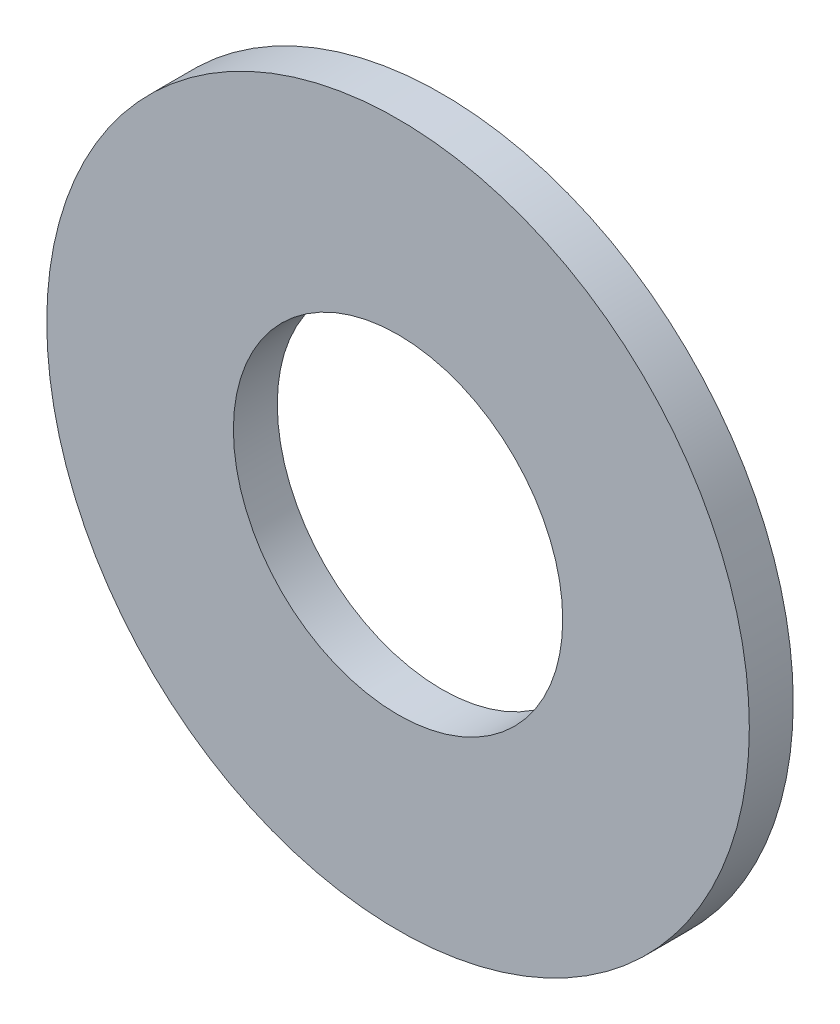
ISO-10303-21;
HEADER;
FILE_DESCRIPTION(('STEP AP214'),'2;1');
FILE_NAME('part.step','',(''),(''),'','','');
FILE_SCHEMA(('AUTOMOTIVE_DESIGN { 1 0 10303 214 1 1 1 1 }'));
ENDSEC;
DATA;
#1=APPLICATION_CONTEXT('core data for automotive mechanical design processes');
#2=APPLICATION_PROTOCOL_DEFINITION('international standard','automotive_design',2000,#1);
#3=PRODUCT_CONTEXT('',#1,'mechanical');
#4=PRODUCT('Part','Part','',(#3));
#5=PRODUCT_RELATED_PRODUCT_CATEGORY('part','',(#4));
#6=PRODUCT_DEFINITION_FORMATION('','',#4);
#7=PRODUCT_DEFINITION_CONTEXT('part definition',#1,'design');
#8=PRODUCT_DEFINITION('design','',#6,#7);
#9=PRODUCT_DEFINITION_SHAPE('','',#8);
#10=(LENGTH_UNIT() NAMED_UNIT(*) SI_UNIT(.MILLI.,.METRE.));
#11=(NAMED_UNIT(*) PLANE_ANGLE_UNIT() SI_UNIT($,.RADIAN.));
#12=(NAMED_UNIT(*) SI_UNIT($,.STERADIAN.) SOLID_ANGLE_UNIT());
#13=UNCERTAINTY_MEASURE_WITH_UNIT(LENGTH_MEASURE(1.E-05),#10,'distance_accuracy_value','');
#14=(GEOMETRIC_REPRESENTATION_CONTEXT(3) GLOBAL_UNCERTAINTY_ASSIGNED_CONTEXT((#13)) GLOBAL_UNIT_ASSIGNED_CONTEXT((#10,
#11,#12)) REPRESENTATION_CONTEXT('',''));
#15=CARTESIAN_POINT('',(0.,0.,0.));
#16=DIRECTION('',(0.,0.,1.));
#17=DIRECTION('',(1.,0.,0.));
#18=AXIS2_PLACEMENT_3D('',#15,#16,#17);
#19=CARTESIAN_POINT('',(0.,0.,1.));
#20=DIRECTION('',(0.,0.,1.));
#21=DIRECTION('',(1.,0.,0.));
#22=AXIS2_PLACEMENT_3D('',#19,#20,#21);
#23=PLANE('',#22);
#24=CARTESIAN_POINT('',(0.,0.,1.));
#25=DIRECTION('',(0.,0.,1.));
#26=DIRECTION('',(1.,0.,0.));
#27=AXIS2_PLACEMENT_3D('',#24,#25,#26);
#28=CIRCLE('',#27,16.);
#29=CARTESIAN_POINT('',(16.,0.,1.));
#30=VERTEX_POINT('',#29);
#31=EDGE_CURVE('E10',#30,#30,#28,.T.);
#32=ORIENTED_EDGE('',*,*,#31,.T.);
#33=EDGE_LOOP('',(#32));
#34=FACE_BOUND('',#33,.T.);
#35=CARTESIAN_POINT('',(0.,0.,1.));
#36=DIRECTION('',(0.,0.,1.));
#37=DIRECTION('',(1.,0.,0.));
#38=AXIS2_PLACEMENT_3D('',#35,#36,#37);
#39=CIRCLE('',#38,7.5);
#40=CARTESIAN_POINT('',(7.5,0.,1.));
#41=VERTEX_POINT('',#40);
#42=EDGE_CURVE('E41',#41,#41,#39,.T.);
#43=ORIENTED_EDGE('',*,*,#42,.F.);
#44=EDGE_LOOP('',(#43));
#45=FACE_BOUND('',#44,.T.);
#46=ADVANCED_FACE('F30',(#34,#45),#23,.T.);
#47=CARTESIAN_POINT('',(0.,0.,-1.));
#48=DIRECTION('',(0.,0.,1.));
#49=DIRECTION('',(1.,0.,0.));
#50=AXIS2_PLACEMENT_3D('',#47,#48,#49);
#51=PLANE('',#50);
#52=CARTESIAN_POINT('',(0.,0.,-1.));
#53=DIRECTION('',(0.,0.,1.));
#54=DIRECTION('',(1.,0.,0.));
#55=AXIS2_PLACEMENT_3D('',#52,#53,#54);
#56=CIRCLE('',#55,16.);
#57=CARTESIAN_POINT('',(16.,0.,-1.));
#58=VERTEX_POINT('',#57);
#59=EDGE_CURVE('E34',#58,#58,#56,.T.);
#60=ORIENTED_EDGE('',*,*,#59,.F.);
#61=EDGE_LOOP('',(#60));
#62=FACE_BOUND('',#61,.T.);
#63=CARTESIAN_POINT('',(0.,0.,-1.));
#64=DIRECTION('',(0.,0.,1.));
#65=DIRECTION('',(1.,0.,0.));
#66=AXIS2_PLACEMENT_3D('',#63,#64,#65);
#67=CIRCLE('',#66,7.5);
#68=CARTESIAN_POINT('',(7.5,0.,-1.));
#69=VERTEX_POINT('',#68);
#70=EDGE_CURVE('E43',#69,#69,#67,.T.);
#71=ORIENTED_EDGE('',*,*,#70,.T.);
#72=EDGE_LOOP('',(#71));
#73=FACE_BOUND('',#72,.T.);
#74=ADVANCED_FACE('F53',(#62,#73),#51,.F.);
#75=CARTESIAN_POINT('',(0.,0.,1.));
#76=DIRECTION('',(0.,0.,-1.));
#77=DIRECTION('',(-1.,0.,0.));
#78=AXIS2_PLACEMENT_3D('',#75,#76,#77);
#79=CYLINDRICAL_SURFACE('',#78,16.);
#80=ORIENTED_EDGE('',*,*,#31,.F.);
#81=EDGE_LOOP('',(#80));
#82=FACE_BOUND('',#81,.T.);
#83=ORIENTED_EDGE('',*,*,#59,.T.);
#84=EDGE_LOOP('',(#83));
#85=FACE_BOUND('',#84,.T.);
#86=ADVANCED_FACE('F32',(#82,#85),#79,.T.);
#87=CARTESIAN_POINT('',(0.,0.,1.));
#88=DIRECTION('',(0.,0.,-1.));
#89=DIRECTION('',(-1.,0.,0.));
#90=AXIS2_PLACEMENT_3D('',#87,#88,#89);
#91=CYLINDRICAL_SURFACE('',#90,7.5);
#92=ORIENTED_EDGE('',*,*,#42,.T.);
#93=EDGE_LOOP('',(#92));
#94=FACE_BOUND('',#93,.T.);
#95=ORIENTED_EDGE('',*,*,#70,.F.);
#96=EDGE_LOOP('',(#95));
#97=FACE_BOUND('',#96,.T.);
#98=ADVANCED_FACE('F49',(#94,#97),#91,.F.);
#99=CLOSED_SHELL('',(#46,#74,#86,#98));
#100=MANIFOLD_SOLID_BREP('B2',#99);
#101=ADVANCED_BREP_SHAPE_REPRESENTATION('',(#18,#100),#14);
#102=SHAPE_DEFINITION_REPRESENTATION(#9,#101);
ENDSEC;
END-ISO-10303-21;
